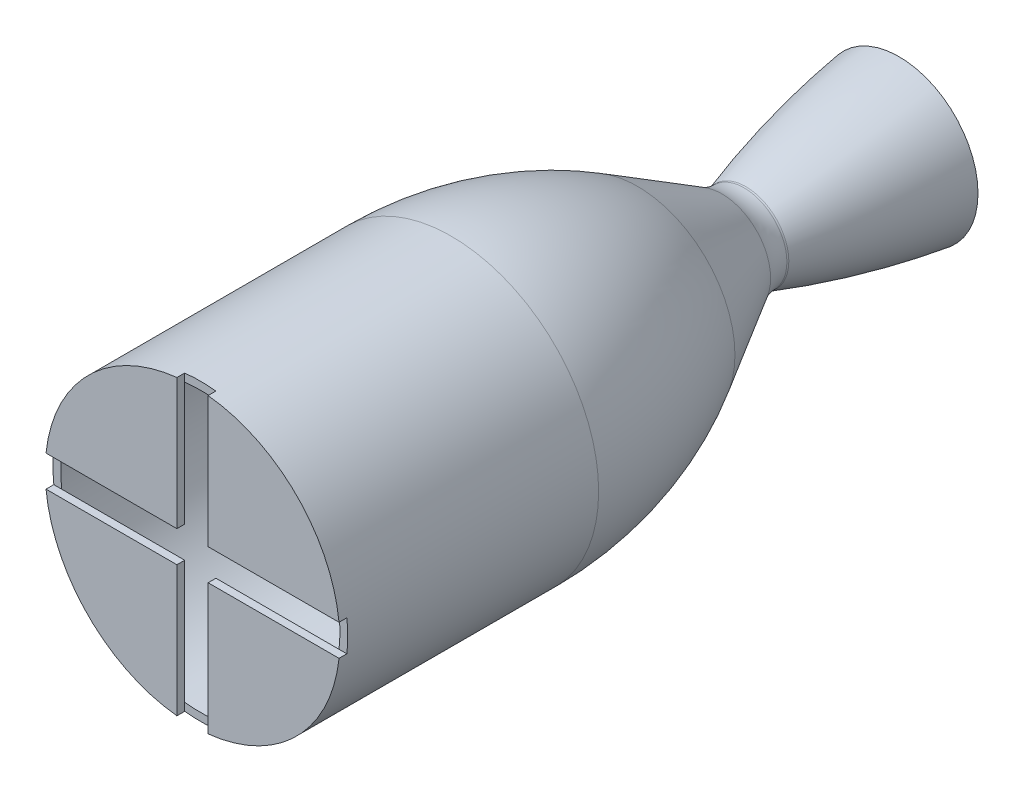
ISO-10303-21;
HEADER;
FILE_DESCRIPTION(('STEP AP214'),'2;1');
FILE_NAME('part.step','',(''),(''),'','','');
FILE_SCHEMA(('AUTOMOTIVE_DESIGN { 1 0 10303 214 1 1 1 1 }'));
ENDSEC;
DATA;
#1=APPLICATION_CONTEXT('core data for automotive mechanical design processes');
#2=APPLICATION_PROTOCOL_DEFINITION('international standard','automotive_design',2000,#1);
#3=PRODUCT_CONTEXT('',#1,'mechanical');
#4=PRODUCT('Part','Part','',(#3));
#5=PRODUCT_RELATED_PRODUCT_CATEGORY('part','',(#4));
#6=PRODUCT_DEFINITION_FORMATION('','',#4);
#7=PRODUCT_DEFINITION_CONTEXT('part definition',#1,'design');
#8=PRODUCT_DEFINITION('design','',#6,#7);
#9=PRODUCT_DEFINITION_SHAPE('','',#8);
#10=(LENGTH_UNIT() NAMED_UNIT(*) SI_UNIT(.MILLI.,.METRE.));
#11=(NAMED_UNIT(*) PLANE_ANGLE_UNIT() SI_UNIT($,.RADIAN.));
#12=(NAMED_UNIT(*) SI_UNIT($,.STERADIAN.) SOLID_ANGLE_UNIT());
#13=UNCERTAINTY_MEASURE_WITH_UNIT(LENGTH_MEASURE(1.E-05),#10,'distance_accuracy_value','');
#14=(GEOMETRIC_REPRESENTATION_CONTEXT(3) GLOBAL_UNCERTAINTY_ASSIGNED_CONTEXT((#13)) GLOBAL_UNIT_ASSIGNED_CONTEXT((#10,
#11,#12)) REPRESENTATION_CONTEXT('',''));
#15=CARTESIAN_POINT('',(0.,0.,0.));
#16=DIRECTION('',(0.,0.,1.));
#17=DIRECTION('',(1.,0.,0.));
#18=AXIS2_PLACEMENT_3D('',#15,#16,#17);
#19=CARTESIAN_POINT('',(0.,0.,0.));
#20=DIRECTION('',(0.,0.,-1.));
#21=DIRECTION('',(-1.,0.,0.));
#22=AXIS2_PLACEMENT_3D('',#19,#20,#21);
#23=PLANE('',#22);
#24=DIRECTION('',(0.,1.,0.));
#25=VECTOR('',#24,1.);
#26=CARTESIAN_POINT('',(-6.34999999999979,-59.9440000000002,0.));
#27=LINE('',#26,#25);
#28=CARTESIAN_POINT('',(-6.3499999999998,-56.4127366912828,0.));
#29=VERTEX_POINT('',#28);
#30=CARTESIAN_POINT('',(-6.34999999999998,-6.35,0.));
#31=VERTEX_POINT('',#30);
#32=EDGE_CURVE('E307',#29,#31,#27,.T.);
#33=ORIENTED_EDGE('',*,*,#32,.F.);
#34=CARTESIAN_POINT('',(0.,0.,0.));
#35=DIRECTION('',(0.,0.,1.));
#36=DIRECTION('',(1.,0.,0.));
#37=AXIS2_PLACEMENT_3D('',#34,#35,#36);
#38=CIRCLE('',#37,56.769);
#39=CARTESIAN_POINT('',(-56.4127366912828,-6.35,0.));
#40=VERTEX_POINT('',#39);
#41=EDGE_CURVE('E283',#40,#29,#38,.T.);
#42=ORIENTED_EDGE('',*,*,#41,.F.);
#43=DIRECTION('',(1.,0.,0.));
#44=VECTOR('',#43,1.);
#45=CARTESIAN_POINT('',(-59.944,-6.35,0.));
#46=LINE('',#45,#44);
#47=EDGE_CURVE('E348',#40,#31,#46,.T.);
#48=ORIENTED_EDGE('',*,*,#47,.T.);
#49=EDGE_LOOP('',(#33,#42,#48));
#50=FACE_BOUND('',#49,.T.);
#51=ADVANCED_FACE('F34',(#50),#23,.T.);
#52=CARTESIAN_POINT('',(0.,0.,3.175));
#53=DIRECTION('',(0.,0.,-1.));
#54=DIRECTION('',(-1.,0.,0.));
#55=AXIS2_PLACEMENT_3D('',#52,#53,#54);
#56=PLANE('',#55);
#57=DIRECTION('',(1.,0.,0.));
#58=VECTOR('',#57,1.);
#59=CARTESIAN_POINT('',(-59.944,6.35,3.175));
#60=LINE('',#59,#58);
#61=CARTESIAN_POINT('',(-59.6067163665304,6.35,3.175));
#62=VERTEX_POINT('',#61);
#63=CARTESIAN_POINT('',(-6.35000000000002,6.34999999999999,3.175));
#64=VERTEX_POINT('',#63);
#65=EDGE_CURVE('E195',#62,#64,#60,.T.);
#66=ORIENTED_EDGE('',*,*,#65,.T.);
#67=DIRECTION('',(0.,1.,0.));
#68=VECTOR('',#67,1.);
#69=CARTESIAN_POINT('',(-6.34999999999979,-59.9440000000002,3.175));
#70=LINE('',#69,#68);
#71=CARTESIAN_POINT('',(-6.35000000000021,59.6067163665303,3.175));
#72=VERTEX_POINT('',#71);
#73=EDGE_CURVE('E305',#64,#72,#70,.T.);
#74=ORIENTED_EDGE('',*,*,#73,.T.);
#75=CARTESIAN_POINT('',(0.,0.,3.175));
#76=DIRECTION('',(0.,0.,1.));
#77=DIRECTION('',(1.,0.,0.));
#78=AXIS2_PLACEMENT_3D('',#75,#76,#77);
#79=CIRCLE('',#78,59.944);
#80=EDGE_CURVE('E216',#72,#62,#79,.T.);
#81=ORIENTED_EDGE('',*,*,#80,.T.);
#82=EDGE_LOOP('',(#66,#74,#81));
#83=FACE_BOUND('',#82,.T.);
#84=ADVANCED_FACE('F365',(#83),#56,.F.);
#85=CARTESIAN_POINT('',(-59.6067163665304,-6.35,3.175));
#86=VERTEX_POINT('',#85);
#87=CARTESIAN_POINT('',(-6.34999999999979,-59.6067163665304,3.175));
#88=VERTEX_POINT('',#87);
#89=EDGE_CURVE('E213',#86,#88,#79,.T.);
#90=ORIENTED_EDGE('',*,*,#89,.T.);
#91=CARTESIAN_POINT('',(-6.34999999999998,-6.35,3.175));
#92=VERTEX_POINT('',#91);
#93=EDGE_CURVE('E179',#88,#92,#70,.T.);
#94=ORIENTED_EDGE('',*,*,#93,.T.);
#95=DIRECTION('',(1.,0.,0.));
#96=VECTOR('',#95,1.);
#97=CARTESIAN_POINT('',(-59.944,-6.35,3.175));
#98=LINE('',#97,#96);
#99=EDGE_CURVE('E210',#86,#92,#98,.T.);
#100=ORIENTED_EDGE('',*,*,#99,.F.);
#101=EDGE_LOOP('',(#90,#94,#100));
#102=FACE_BOUND('',#101,.T.);
#103=ADVANCED_FACE('F369',(#102),#56,.F.);
#104=CARTESIAN_POINT('',(-6.35000000000002,6.34999999999999,0.));
#105=VERTEX_POINT('',#104);
#106=CARTESIAN_POINT('',(-6.3500000000002,56.4127366912827,0.));
#107=VERTEX_POINT('',#106);
#108=EDGE_CURVE('E304',#105,#107,#27,.T.);
#109=ORIENTED_EDGE('',*,*,#108,.F.);
#110=DIRECTION('',(1.,0.,0.));
#111=VECTOR('',#110,1.);
#112=CARTESIAN_POINT('',(-59.944,6.35,0.));
#113=LINE('',#112,#111);
#114=CARTESIAN_POINT('',(-56.4127366912828,6.35,0.));
#115=VERTEX_POINT('',#114);
#116=EDGE_CURVE('E319',#115,#105,#113,.T.);
#117=ORIENTED_EDGE('',*,*,#116,.F.);
#118=EDGE_CURVE('E259',#107,#115,#38,.T.);
#119=ORIENTED_EDGE('',*,*,#118,.F.);
#120=EDGE_LOOP('',(#109,#117,#119));
#121=FACE_BOUND('',#120,.T.);
#122=ADVANCED_FACE('F318',(#121),#23,.T.);
#123=CARTESIAN_POINT('',(-59.944,6.35,3.175));
#124=DIRECTION('',(0.,1.,0.));
#125=DIRECTION('',(0.,0.,1.));
#126=AXIS2_PLACEMENT_3D('',#123,#124,#125);
#127=PLANE('',#126);
#128=ORIENTED_EDGE('',*,*,#116,.T.);
#129=DIRECTION('',(0.,0.,1.));
#130=VECTOR('',#129,1.);
#131=CARTESIAN_POINT('',(-6.35000000000002,6.35,3.175));
#132=LINE('',#131,#130);
#133=EDGE_CURVE('E186',#105,#64,#132,.T.);
#134=ORIENTED_EDGE('',*,*,#133,.T.);
#135=ORIENTED_EDGE('',*,*,#65,.F.);
#136=DIRECTION('',(0.,0.,1.));
#137=VECTOR('',#136,1.);
#138=CARTESIAN_POINT('',(-59.6067163665304,6.35,0.));
#139=LINE('',#138,#137);
#140=CARTESIAN_POINT('',(-59.6067163665304,6.35,0.));
#141=VERTEX_POINT('',#140);
#142=EDGE_CURVE('E271',#141,#62,#139,.T.);
#143=ORIENTED_EDGE('',*,*,#142,.F.);
#144=EDGE_CURVE('E205',#141,#115,#113,.T.);
#145=ORIENTED_EDGE('',*,*,#144,.T.);
#146=EDGE_LOOP('',(#128,#134,#135,#143,#145));
#147=FACE_BOUND('',#146,.T.);
#148=ADVANCED_FACE('F336',(#147),#127,.F.);
#149=CARTESIAN_POINT('',(-59.944,-6.35,3.175));
#150=DIRECTION('',(0.,-1.,0.));
#151=DIRECTION('',(0.,0.,-1.));
#152=AXIS2_PLACEMENT_3D('',#149,#150,#151);
#153=PLANE('',#152);
#154=ORIENTED_EDGE('',*,*,#99,.T.);
#155=DIRECTION('',(0.,0.,-1.));
#156=VECTOR('',#155,1.);
#157=CARTESIAN_POINT('',(-6.34999999999998,-6.35,3.175));
#158=LINE('',#157,#156);
#159=EDGE_CURVE('E11',#92,#31,#158,.T.);
#160=ORIENTED_EDGE('',*,*,#159,.T.);
#161=ORIENTED_EDGE('',*,*,#47,.F.);
#162=CARTESIAN_POINT('',(-59.6067163665304,-6.35,0.));
#163=VERTEX_POINT('',#162);
#164=EDGE_CURVE('E204',#163,#40,#46,.T.);
#165=ORIENTED_EDGE('',*,*,#164,.F.);
#166=DIRECTION('',(0.,0.,1.));
#167=VECTOR('',#166,1.);
#168=CARTESIAN_POINT('',(-59.6067163665304,-6.35,0.));
#169=LINE('',#168,#167);
#170=EDGE_CURVE('E265',#86,#163,#169,.F.);
#171=ORIENTED_EDGE('',*,*,#170,.F.);
#172=EDGE_LOOP('',(#154,#160,#161,#165,#171));
#173=FACE_BOUND('',#172,.T.);
#174=ADVANCED_FACE('F363',(#173),#153,.F.);
#175=DIRECTION('',(0.,1.,0.));
#176=VECTOR('',#175,1.);
#177=CARTESIAN_POINT('',(6.35000000000021,-59.9440000000002,0.));
#178=LINE('',#177,#176);
#179=CARTESIAN_POINT('',(6.3500000000002,-56.4127366912827,0.));
#180=VERTEX_POINT('',#179);
#181=CARTESIAN_POINT('',(6.35000000000002,-6.35,0.));
#182=VERTEX_POINT('',#181);
#183=EDGE_CURVE('E165',#180,#182,#178,.T.);
#184=ORIENTED_EDGE('',*,*,#183,.T.);
#185=CARTESIAN_POINT('',(56.4127366912828,-6.35,0.));
#186=VERTEX_POINT('',#185);
#187=EDGE_CURVE('E209',#182,#186,#46,.T.);
#188=ORIENTED_EDGE('',*,*,#187,.T.);
#189=EDGE_CURVE('E254',#180,#186,#38,.T.);
#190=ORIENTED_EDGE('',*,*,#189,.F.);
#191=EDGE_LOOP('',(#184,#188,#190));
#192=FACE_BOUND('',#191,.T.);
#193=ADVANCED_FACE('F347',(#192),#23,.T.);
#194=CARTESIAN_POINT('',(59.6067163665304,6.35,3.175));
#195=VERTEX_POINT('',#194);
#196=CARTESIAN_POINT('',(6.34999999999979,59.6067163665304,3.175));
#197=VERTEX_POINT('',#196);
#198=EDGE_CURVE('E217',#195,#197,#79,.T.);
#199=ORIENTED_EDGE('',*,*,#198,.T.);
#200=DIRECTION('',(0.,1.,0.));
#201=VECTOR('',#200,1.);
#202=CARTESIAN_POINT('',(6.35000000000021,-59.9440000000002,3.175));
#203=LINE('',#202,#201);
#204=CARTESIAN_POINT('',(6.34999999999998,6.34999999999999,3.175));
#205=VERTEX_POINT('',#204);
#206=EDGE_CURVE('E292',#205,#197,#203,.T.);
#207=ORIENTED_EDGE('',*,*,#206,.F.);
#208=EDGE_CURVE('E199',#205,#195,#60,.T.);
#209=ORIENTED_EDGE('',*,*,#208,.T.);
#210=EDGE_LOOP('',(#199,#207,#209));
#211=FACE_BOUND('',#210,.T.);
#212=ADVANCED_FACE('F291',(#211),#56,.F.);
#213=CARTESIAN_POINT('',(6.35000000000003,-6.35,3.175));
#214=VERTEX_POINT('',#213);
#215=CARTESIAN_POINT('',(59.6067163665304,-6.35,3.175));
#216=VERTEX_POINT('',#215);
#217=EDGE_CURVE('E194',#214,#216,#98,.T.);
#218=ORIENTED_EDGE('',*,*,#217,.F.);
#219=CARTESIAN_POINT('',(6.35000000000021,-59.6067163665303,3.175));
#220=VERTEX_POINT('',#219);
#221=EDGE_CURVE('E57',#220,#214,#203,.T.);
#222=ORIENTED_EDGE('',*,*,#221,.F.);
#223=EDGE_CURVE('E174',#220,#216,#79,.T.);
#224=ORIENTED_EDGE('',*,*,#223,.T.);
#225=EDGE_LOOP('',(#218,#222,#224));
#226=FACE_BOUND('',#225,.T.);
#227=ADVANCED_FACE('F36',(#226),#56,.F.);
#228=CARTESIAN_POINT('',(6.34999999999997,6.35,0.));
#229=VERTEX_POINT('',#228);
#230=CARTESIAN_POINT('',(6.3499999999998,56.4127366912828,0.));
#231=VERTEX_POINT('',#230);
#232=EDGE_CURVE('E49',#229,#231,#178,.T.);
#233=ORIENTED_EDGE('',*,*,#232,.T.);
#234=CARTESIAN_POINT('',(56.4127366912828,6.35,0.));
#235=VERTEX_POINT('',#234);
#236=EDGE_CURVE('E255',#235,#231,#38,.T.);
#237=ORIENTED_EDGE('',*,*,#236,.F.);
#238=EDGE_CURVE('E203',#229,#235,#113,.T.);
#239=ORIENTED_EDGE('',*,*,#238,.F.);
#240=EDGE_LOOP('',(#233,#237,#239));
#241=FACE_BOUND('',#240,.T.);
#242=ADVANCED_FACE('F329',(#241),#23,.T.);
#243=CARTESIAN_POINT('',(0.,0.,0.));
#244=DIRECTION('',(0.,0.,1.));
#245=DIRECTION('',(1.,0.,0.));
#246=AXIS2_PLACEMENT_3D('',#243,#244,#245);
#247=CYLINDRICAL_SURFACE('',#246,56.769);
#248=ORIENTED_EDGE('',*,*,#236,.T.);
#249=CARTESIAN_POINT('',(0.,0.,0.));
#250=DIRECTION('',(0.,0.,-1.));
#251=DIRECTION('',(-1.,0.,0.));
#252=AXIS2_PLACEMENT_3D('',#249,#250,#251);
#253=CIRCLE('',#252,56.769);
#254=EDGE_CURVE('E185',#107,#231,#253,.T.);
#255=ORIENTED_EDGE('',*,*,#254,.F.);
#256=ORIENTED_EDGE('',*,*,#118,.T.);
#257=EDGE_CURVE('E281',#115,#40,#38,.T.);
#258=ORIENTED_EDGE('',*,*,#257,.T.);
#259=ORIENTED_EDGE('',*,*,#41,.T.);
#260=EDGE_CURVE('E183',#180,#29,#253,.T.);
#261=ORIENTED_EDGE('',*,*,#260,.F.);
#262=ORIENTED_EDGE('',*,*,#189,.T.);
#263=EDGE_CURVE('E198',#186,#235,#38,.T.);
#264=ORIENTED_EDGE('',*,*,#263,.T.);
#265=EDGE_LOOP('',(#248,#255,#256,#258,#259,#261,#262,#264));
#266=FACE_BOUND('',#265,.T.);
#267=CARTESIAN_POINT('',(0.,0.,-102.108));
#268=DIRECTION('',(0.,0.,1.));
#269=DIRECTION('',(1.,0.,0.));
#270=AXIS2_PLACEMENT_3D('',#267,#268,#269);
#271=CIRCLE('',#270,56.769);
#272=CARTESIAN_POINT('',(56.769,0.,-102.108));
#273=VERTEX_POINT('',#272);
#274=EDGE_CURVE('E251',#273,#273,#271,.T.);
#275=ORIENTED_EDGE('',*,*,#274,.F.);
#276=EDGE_LOOP('',(#275));
#277=FACE_BOUND('',#276,.T.);
#278=ADVANCED_FACE('F322',(#266,#277),#247,.F.);
#279=CARTESIAN_POINT('',(0.,0.,-102.108));
#280=DIRECTION('',(0.,0.,1.));
#281=DIRECTION('',(1.,0.,0.));
#282=AXIS2_PLACEMENT_3D('',#279,#280,#281);
#283=DEGENERATE_TOROIDAL_SURFACE('',#282,91.567,148.336,.F.);
#284=ORIENTED_EDGE('',*,*,#274,.T.);
#285=EDGE_LOOP('',(#284));
#286=FACE_BOUND('',#285,.T.);
#287=CARTESIAN_POINT('',(0.,0.,-176.276));
#288=DIRECTION('',(0.,0.,1.));
#289=DIRECTION('',(1.,0.,0.));
#290=AXIS2_PLACEMENT_3D('',#287,#288,#289);
#291=CIRCLE('',#290,36.8957442957684);
#292=CARTESIAN_POINT('',(36.8957442957684,0.,-176.276));
#293=VERTEX_POINT('',#292);
#294=EDGE_CURVE('E248',#293,#293,#291,.T.);
#295=ORIENTED_EDGE('',*,*,#294,.F.);
#296=EDGE_LOOP('',(#295));
#297=FACE_BOUND('',#296,.T.);
#298=ADVANCED_FACE('F377',(#286,#297),#283,.T.);
#299=CARTESIAN_POINT('',(0.,0.,-210.593607923697));
#300=DIRECTION('',(0.,0.,1.));
#301=DIRECTION('',(1.,0.,0.));
#302=AXIS2_PLACEMENT_3D('',#299,#300,#301);
#303=CONICAL_SURFACE('',#302,17.0824641230777,0.523598775598301);
#304=ORIENTED_EDGE('',*,*,#294,.T.);
#305=EDGE_LOOP('',(#304));
#306=FACE_BOUND('',#305,.T.);
#307=CARTESIAN_POINT('',(0.,0.,-210.593607923697));
#308=DIRECTION('',(0.,0.,1.));
#309=DIRECTION('',(1.,0.,0.));
#310=AXIS2_PLACEMENT_3D('',#307,#308,#309);
#311=CIRCLE('',#310,17.0824641230777);
#312=CARTESIAN_POINT('',(17.0824641230777,0.,-210.593607923697));
#313=VERTEX_POINT('',#312);
#314=EDGE_CURVE('E245',#313,#313,#311,.T.);
#315=ORIENTED_EDGE('',*,*,#314,.F.);
#316=EDGE_LOOP('',(#315));
#317=FACE_BOUND('',#316,.T.);
#318=ADVANCED_FACE('F491',(#306,#317),#303,.F.);
#319=CARTESIAN_POINT('',(0.,0.,-221.261607923697));
#320=DIRECTION('',(0.,0.,1.));
#321=DIRECTION('',(1.,0.,0.));
#322=AXIS2_PLACEMENT_3D('',#319,#320,#321);
#323=TOROIDAL_SURFACE('',#322,35.5599821382225,21.336);
#324=ORIENTED_EDGE('',*,*,#314,.T.);
#325=EDGE_LOOP('',(#324));
#326=FACE_BOUND('',#325,.T.);
#327=CARTESIAN_POINT('',(0.,0.,-221.234));
#328=DIRECTION('',(0.,0.,1.));
#329=DIRECTION('',(1.,0.,0.));
#330=AXIS2_PLACEMENT_3D('',#327,#328,#329);
#331=CIRCLE('',#330,14.224);
#332=CARTESIAN_POINT('',(14.224,0.,-221.234));
#333=VERTEX_POINT('',#332);
#334=EDGE_CURVE('E242',#333,#333,#331,.T.);
#335=ORIENTED_EDGE('',*,*,#334,.F.);
#336=EDGE_LOOP('',(#335));
#337=FACE_BOUND('',#336,.T.);
#338=ADVANCED_FACE('F481',(#326,#337),#323,.T.);
#339=CARTESIAN_POINT('',(0.,0.,-221.240901980924));
#340=DIRECTION('',(0.,0.,1.));
#341=DIRECTION('',(1.,0.,0.));
#342=AXIS2_PLACEMENT_3D('',#339,#340,#341);
#343=TOROIDAL_SURFACE('',#342,19.5579955345556,5.33399999999999);
#344=ORIENTED_EDGE('',*,*,#334,.T.);
#345=EDGE_LOOP('',(#344));
#346=FACE_BOUND('',#345,.T.);
#347=CARTESIAN_POINT('',(0.,0.,-222.91043356868));
#348=DIRECTION('',(0.,0.,1.));
#349=DIRECTION('',(1.,0.,0.));
#350=AXIS2_PLACEMENT_3D('',#347,#348,#349);
#351=CIRCLE('',#350,14.4920089300052);
#352=CARTESIAN_POINT('',(14.4920089300052,0.,-222.91043356868));
#353=VERTEX_POINT('',#352);
#354=EDGE_CURVE('E239',#353,#353,#351,.T.);
#355=ORIENTED_EDGE('',*,*,#354,.F.);
#356=EDGE_LOOP('',(#355));
#357=FACE_BOUND('',#356,.T.);
#358=ADVANCED_FACE('F471',(#346,#357),#343,.T.);
#359=CARTESIAN_POINT('',(0.,0.,-335.302405298385));
#360=DIRECTION('',(0.,0.,1.));
#361=DIRECTION('',(1.,0.,0.));
#362=AXIS2_PLACEMENT_3D('',#359,#360,#361);
#363=DEGENERATE_TOROIDAL_SURFACE('',#362,326.547494256012,359.082021330303,.F.);
#364=ORIENTED_EDGE('',*,*,#354,.T.);
#365=EDGE_LOOP('',(#364));
#366=FACE_BOUND('',#365,.T.);
#367=CARTESIAN_POINT('',(0.,0.,-284.734));
#368=DIRECTION('',(0.,0.,1.));
#369=DIRECTION('',(1.,0.,0.));
#370=AXIS2_PLACEMENT_3D('',#367,#368,#369);
#371=CIRCLE('',#370,28.956);
#372=CARTESIAN_POINT('',(28.956,0.,-284.734));
#373=VERTEX_POINT('',#372);
#374=EDGE_CURVE('E236',#373,#373,#371,.T.);
#375=ORIENTED_EDGE('',*,*,#374,.F.);
#376=EDGE_LOOP('',(#375));
#377=FACE_BOUND('',#376,.T.);
#378=ADVANCED_FACE('F461',(#366,#377),#363,.T.);
#379=CARTESIAN_POINT('',(0.,0.,-284.286874615589));
#380=DIRECTION('',(0.,0.,1.));
#381=DIRECTION('',(1.,0.,0.));
#382=AXIS2_PLACEMENT_3D('',#379,#380,#381);
#383=CONICAL_SURFACE('',#382,32.0993586958244,1.42949974529868);
#384=ORIENTED_EDGE('',*,*,#374,.T.);
#385=EDGE_LOOP('',(#384));
#386=FACE_BOUND('',#385,.T.);
#387=CARTESIAN_POINT('',(0.,0.,-284.286874615589));
#388=DIRECTION('',(0.,0.,1.));
#389=DIRECTION('',(1.,0.,0.));
#390=AXIS2_PLACEMENT_3D('',#387,#388,#389);
#391=CIRCLE('',#390,32.0993586958244);
#392=CARTESIAN_POINT('',(32.0993586958244,0.,-284.286874615589));
#393=VERTEX_POINT('',#392);
#394=EDGE_CURVE('E233',#393,#393,#391,.T.);
#395=ORIENTED_EDGE('',*,*,#394,.F.);
#396=EDGE_LOOP('',(#395));
#397=FACE_BOUND('',#396,.T.);
#398=ADVANCED_FACE('F451',(#386,#397),#383,.T.);
#399=CARTESIAN_POINT('',(0.,0.,-335.302405298385));
#400=DIRECTION('',(0.,0.,1.));
#401=DIRECTION('',(1.,0.,0.));
#402=AXIS2_PLACEMENT_3D('',#399,#400,#401);
#403=DEGENERATE_TOROIDAL_SURFACE('',#402,326.547494256012,362.257021330303,.F.);
#404=CARTESIAN_POINT('',(0.,0.,-221.916664766445));
#405=DIRECTION('',(0.,0.,1.));
#406=DIRECTION('',(1.,0.,0.));
#407=AXIS2_PLACEMENT_3D('',#404,#405,#406);
#408=CIRCLE('',#407,17.5074771469995);
#409=CARTESIAN_POINT('',(17.5074771469995,0.,-221.916664766445));
#410=VERTEX_POINT('',#409);
#411=EDGE_CURVE('E230',#410,#410,#408,.T.);
#412=ORIENTED_EDGE('',*,*,#411,.F.);
#413=EDGE_LOOP('',(#412));
#414=FACE_BOUND('',#413,.T.);
#415=ORIENTED_EDGE('',*,*,#394,.T.);
#416=EDGE_LOOP('',(#415));
#417=FACE_BOUND('',#416,.T.);
#418=ADVANCED_FACE('F441',(#414,#417),#403,.F.);
#419=CARTESIAN_POINT('',(0.,0.,-221.240901980924));
#420=DIRECTION('',(0.,0.,1.));
#421=DIRECTION('',(1.,0.,0.));
#422=AXIS2_PLACEMENT_3D('',#419,#420,#421);
#423=TOROIDAL_SURFACE('',#422,19.5579955345556,2.15899999999999);
#424=CARTESIAN_POINT('',(0.,0.,-221.238108321979));
#425=DIRECTION('',(0.,0.,1.));
#426=DIRECTION('',(1.,0.,0.));
#427=AXIS2_PLACEMENT_3D('',#424,#425,#426);
#428=CIRCLE('',#427,17.3989973419974);
#429=CARTESIAN_POINT('',(17.3989973419974,0.,-221.238108321979));
#430=VERTEX_POINT('',#429);
#431=EDGE_CURVE('E227',#430,#430,#428,.T.);
#432=ORIENTED_EDGE('',*,*,#431,.F.);
#433=EDGE_LOOP('',(#432));
#434=FACE_BOUND('',#433,.T.);
#435=ORIENTED_EDGE('',*,*,#411,.T.);
#436=EDGE_LOOP('',(#435));
#437=FACE_BOUND('',#436,.T.);
#438=ADVANCED_FACE('F431',(#434,#437),#423,.F.);
#439=CARTESIAN_POINT('',(0.,0.,-221.261607923697));
#440=DIRECTION('',(0.,0.,1.));
#441=DIRECTION('',(1.,0.,0.));
#442=AXIS2_PLACEMENT_3D('',#439,#440,#441);
#443=TOROIDAL_SURFACE('',#442,35.5599821382225,18.161);
#444=CARTESIAN_POINT('',(0.,0.,-212.181107923697));
#445=DIRECTION('',(0.,0.,1.));
#446=DIRECTION('',(1.,0.,0.));
#447=AXIS2_PLACEMENT_3D('',#444,#445,#446);
#448=CIRCLE('',#447,19.8320947800933);
#449=CARTESIAN_POINT('',(19.8320947800933,0.,-212.181107923697));
#450=VERTEX_POINT('',#449);
#451=EDGE_CURVE('E224',#450,#450,#448,.T.);
#452=ORIENTED_EDGE('',*,*,#451,.F.);
#453=EDGE_LOOP('',(#452));
#454=FACE_BOUND('',#453,.T.);
#455=ORIENTED_EDGE('',*,*,#431,.T.);
#456=EDGE_LOOP('',(#455));
#457=FACE_BOUND('',#456,.T.);
#458=ADVANCED_FACE('F421',(#454,#457),#443,.F.);
#459=CARTESIAN_POINT('',(0.,0.,-212.181107923697));
#460=DIRECTION('',(0.,0.,1.));
#461=DIRECTION('',(1.,0.,0.));
#462=AXIS2_PLACEMENT_3D('',#459,#460,#461);
#463=CONICAL_SURFACE('',#462,19.8320947800933,0.523598775598301);
#464=CARTESIAN_POINT('',(0.,0.,-177.8635));
#465=DIRECTION('',(0.,0.,1.));
#466=DIRECTION('',(1.,0.,0.));
#467=AXIS2_PLACEMENT_3D('',#464,#465,#466);
#468=CIRCLE('',#467,39.645374952784);
#469=CARTESIAN_POINT('',(39.645374952784,0.,-177.8635));
#470=VERTEX_POINT('',#469);
#471=EDGE_CURVE('E221',#470,#470,#468,.T.);
#472=ORIENTED_EDGE('',*,*,#471,.F.);
#473=EDGE_LOOP('',(#472));
#474=FACE_BOUND('',#473,.T.);
#475=ORIENTED_EDGE('',*,*,#451,.T.);
#476=EDGE_LOOP('',(#475));
#477=FACE_BOUND('',#476,.T.);
#478=ADVANCED_FACE('F410',(#474,#477),#463,.T.);
#479=CARTESIAN_POINT('',(0.,0.,-102.108));
#480=DIRECTION('',(0.,0.,1.));
#481=DIRECTION('',(1.,0.,0.));
#482=AXIS2_PLACEMENT_3D('',#479,#480,#481);
#483=DEGENERATE_TOROIDAL_SURFACE('',#482,91.567,151.511,.F.);
#484=CARTESIAN_POINT('',(0.,0.,-102.108));
#485=DIRECTION('',(0.,0.,1.));
#486=DIRECTION('',(1.,0.,0.));
#487=AXIS2_PLACEMENT_3D('',#484,#485,#486);
#488=CIRCLE('',#487,59.944);
#489=CARTESIAN_POINT('',(59.944,0.,-102.108));
#490=VERTEX_POINT('',#489);
#491=EDGE_CURVE('E218',#490,#490,#488,.T.);
#492=ORIENTED_EDGE('',*,*,#491,.F.);
#493=EDGE_LOOP('',(#492));
#494=FACE_BOUND('',#493,.T.);
#495=ORIENTED_EDGE('',*,*,#471,.T.);
#496=EDGE_LOOP('',(#495));
#497=FACE_BOUND('',#496,.T.);
#498=ADVANCED_FACE('F359',(#494,#497),#483,.F.);
#499=CARTESIAN_POINT('',(0.,0.,0.));
#500=DIRECTION('',(0.,0.,1.));
#501=DIRECTION('',(1.,0.,0.));
#502=AXIS2_PLACEMENT_3D('',#499,#500,#501);
#503=CYLINDRICAL_SURFACE('',#502,59.944);
#504=ORIENTED_EDGE('',*,*,#80,.F.);
#505=DIRECTION('',(0.,0.,1.));
#506=VECTOR('',#505,1.);
#507=CARTESIAN_POINT('',(-6.35000000000021,59.6067163665303,0.));
#508=LINE('',#507,#506);
#509=CARTESIAN_POINT('',(-6.35000000000021,59.6067163665303,0.));
#510=VERTEX_POINT('',#509);
#511=EDGE_CURVE('E189',#72,#510,#508,.F.);
#512=ORIENTED_EDGE('',*,*,#511,.T.);
#513=CARTESIAN_POINT('',(0.,0.,0.));
#514=DIRECTION('',(0.,0.,-1.));
#515=DIRECTION('',(-1.,0.,0.));
#516=AXIS2_PLACEMENT_3D('',#513,#514,#515);
#517=CIRCLE('',#516,59.944);
#518=CARTESIAN_POINT('',(6.34999999999979,59.6067163665304,0.));
#519=VERTEX_POINT('',#518);
#520=EDGE_CURVE('E159',#510,#519,#517,.T.);
#521=ORIENTED_EDGE('',*,*,#520,.T.);
#522=DIRECTION('',(0.,0.,1.));
#523=VECTOR('',#522,1.);
#524=CARTESIAN_POINT('',(6.34999999999979,59.6067163665304,0.));
#525=LINE('',#524,#523);
#526=EDGE_CURVE('E160',#519,#197,#525,.T.);
#527=ORIENTED_EDGE('',*,*,#526,.T.);
#528=ORIENTED_EDGE('',*,*,#198,.F.);
#529=DIRECTION('',(0.,0.,1.));
#530=VECTOR('',#529,1.);
#531=CARTESIAN_POINT('',(59.6067163665304,6.35,0.));
#532=LINE('',#531,#530);
#533=CARTESIAN_POINT('',(59.6067163665304,6.35,0.));
#534=VERTEX_POINT('',#533);
#535=EDGE_CURVE('E268',#195,#534,#532,.F.);
#536=ORIENTED_EDGE('',*,*,#535,.T.);
#537=CARTESIAN_POINT('',(0.,0.,0.));
#538=DIRECTION('',(0.,0.,-1.));
#539=DIRECTION('',(-1.,0.,0.));
#540=AXIS2_PLACEMENT_3D('',#537,#538,#539);
#541=CIRCLE('',#540,59.944);
#542=CARTESIAN_POINT('',(59.6067163665304,-6.35,0.));
#543=VERTEX_POINT('',#542);
#544=EDGE_CURVE('E258',#534,#543,#541,.T.);
#545=ORIENTED_EDGE('',*,*,#544,.T.);
#546=DIRECTION('',(0.,0.,1.));
#547=VECTOR('',#546,1.);
#548=CARTESIAN_POINT('',(59.6067163665304,-6.35,0.));
#549=LINE('',#548,#547);
#550=EDGE_CURVE('E262',#543,#216,#549,.T.);
#551=ORIENTED_EDGE('',*,*,#550,.T.);
#552=ORIENTED_EDGE('',*,*,#223,.F.);
#553=DIRECTION('',(0.,0.,1.));
#554=VECTOR('',#553,1.);
#555=CARTESIAN_POINT('',(6.35000000000021,-59.6067163665303,0.));
#556=LINE('',#555,#554);
#557=CARTESIAN_POINT('',(6.35000000000021,-59.6067163665303,0.));
#558=VERTEX_POINT('',#557);
#559=EDGE_CURVE('E163',#220,#558,#556,.F.);
#560=ORIENTED_EDGE('',*,*,#559,.T.);
#561=CARTESIAN_POINT('',(-6.34999999999979,-59.6067163665304,0.));
#562=VERTEX_POINT('',#561);
#563=EDGE_CURVE('E148',#558,#562,#517,.T.);
#564=ORIENTED_EDGE('',*,*,#563,.T.);
#565=DIRECTION('',(0.,0.,1.));
#566=VECTOR('',#565,1.);
#567=CARTESIAN_POINT('',(-6.34999999999979,-59.6067163665304,0.));
#568=LINE('',#567,#566);
#569=EDGE_CURVE('E192',#562,#88,#568,.T.);
#570=ORIENTED_EDGE('',*,*,#569,.T.);
#571=ORIENTED_EDGE('',*,*,#89,.F.);
#572=ORIENTED_EDGE('',*,*,#170,.T.);
#573=EDGE_CURVE('E263',#163,#141,#541,.T.);
#574=ORIENTED_EDGE('',*,*,#573,.T.);
#575=ORIENTED_EDGE('',*,*,#142,.T.);
#576=EDGE_LOOP('',(#504,#512,#521,#527,#528,#536,#545,#551,#552,#560,#564,#570,#571,#572,#574,#575));
#577=FACE_BOUND('',#576,.T.);
#578=ORIENTED_EDGE('',*,*,#491,.T.);
#579=EDGE_LOOP('',(#578));
#580=FACE_BOUND('',#579,.T.);
#581=ADVANCED_FACE('F171',(#577,#580),#503,.T.);
#582=ORIENTED_EDGE('',*,*,#208,.F.);
#583=DIRECTION('',(0.,0.,-1.));
#584=VECTOR('',#583,1.);
#585=CARTESIAN_POINT('',(6.34999999999997,6.35,3.175));
#586=LINE('',#585,#584);
#587=EDGE_CURVE('E175',#205,#229,#586,.T.);
#588=ORIENTED_EDGE('',*,*,#587,.T.);
#589=ORIENTED_EDGE('',*,*,#238,.T.);
#590=EDGE_CURVE('E200',#235,#534,#113,.T.);
#591=ORIENTED_EDGE('',*,*,#590,.T.);
#592=ORIENTED_EDGE('',*,*,#535,.F.);
#593=EDGE_LOOP('',(#582,#588,#589,#591,#592));
#594=FACE_BOUND('',#593,.T.);
#595=ADVANCED_FACE('F351',(#594),#127,.F.);
#596=CARTESIAN_POINT('',(-59.944,6.35,0.));
#597=DIRECTION('',(0.,0.,-1.));
#598=DIRECTION('',(-1.,0.,0.));
#599=AXIS2_PLACEMENT_3D('',#596,#597,#598);
#600=PLANE('',#599);
#601=ORIENTED_EDGE('',*,*,#144,.F.);
#602=ORIENTED_EDGE('',*,*,#573,.F.);
#603=ORIENTED_EDGE('',*,*,#164,.T.);
#604=ORIENTED_EDGE('',*,*,#257,.F.);
#605=EDGE_LOOP('',(#601,#602,#603,#604));
#606=FACE_BOUND('',#605,.T.);
#607=ADVANCED_FACE('F339',(#606),#600,.F.);
#608=EDGE_CURVE('E206',#186,#543,#46,.T.);
#609=ORIENTED_EDGE('',*,*,#608,.T.);
#610=ORIENTED_EDGE('',*,*,#544,.F.);
#611=ORIENTED_EDGE('',*,*,#590,.F.);
#612=ORIENTED_EDGE('',*,*,#263,.F.);
#613=EDGE_LOOP('',(#609,#610,#611,#612));
#614=FACE_BOUND('',#613,.T.);
#615=ADVANCED_FACE('F350',(#614),#600,.F.);
#616=ORIENTED_EDGE('',*,*,#187,.F.);
#617=DIRECTION('',(0.,0.,1.));
#618=VECTOR('',#617,1.);
#619=CARTESIAN_POINT('',(6.35000000000003,-6.35,3.175));
#620=LINE('',#619,#618);
#621=EDGE_CURVE('E42',#182,#214,#620,.T.);
#622=ORIENTED_EDGE('',*,*,#621,.T.);
#623=ORIENTED_EDGE('',*,*,#217,.T.);
#624=ORIENTED_EDGE('',*,*,#550,.F.);
#625=ORIENTED_EDGE('',*,*,#608,.F.);
#626=EDGE_LOOP('',(#616,#622,#623,#624,#625));
#627=FACE_BOUND('',#626,.T.);
#628=ADVANCED_FACE('F277',(#627),#153,.F.);
#629=CARTESIAN_POINT('',(-6.34999999999979,-59.9440000000002,3.175));
#630=DIRECTION('',(-1.,0.,0.));
#631=DIRECTION('',(0.,-1.,0.));
#632=AXIS2_PLACEMENT_3D('',#629,#630,#631);
#633=PLANE('',#632);
#634=EDGE_CURVE('E154',#562,#29,#27,.T.);
#635=ORIENTED_EDGE('',*,*,#634,.T.);
#636=ORIENTED_EDGE('',*,*,#32,.T.);
#637=ORIENTED_EDGE('',*,*,#159,.F.);
#638=ORIENTED_EDGE('',*,*,#93,.F.);
#639=ORIENTED_EDGE('',*,*,#569,.F.);
#640=EDGE_LOOP('',(#635,#636,#637,#638,#639));
#641=FACE_BOUND('',#640,.T.);
#642=ADVANCED_FACE('F388',(#641),#633,.F.);
#643=CARTESIAN_POINT('',(6.35000000000021,-59.9440000000002,3.175));
#644=DIRECTION('',(1.,0.,0.));
#645=DIRECTION('',(0.,1.,0.));
#646=AXIS2_PLACEMENT_3D('',#643,#644,#645);
#647=PLANE('',#646);
#648=ORIENTED_EDGE('',*,*,#221,.T.);
#649=ORIENTED_EDGE('',*,*,#621,.F.);
#650=ORIENTED_EDGE('',*,*,#183,.F.);
#651=EDGE_CURVE('E151',#558,#180,#178,.T.);
#652=ORIENTED_EDGE('',*,*,#651,.F.);
#653=ORIENTED_EDGE('',*,*,#559,.F.);
#654=EDGE_LOOP('',(#648,#649,#650,#652,#653));
#655=FACE_BOUND('',#654,.T.);
#656=ADVANCED_FACE('F162',(#655),#647,.F.);
#657=CARTESIAN_POINT('',(-6.34999999999979,-59.9440000000002,0.));
#658=DIRECTION('',(0.,0.,-1.));
#659=DIRECTION('',(-1.,0.,0.));
#660=AXIS2_PLACEMENT_3D('',#657,#658,#659);
#661=PLANE('',#660);
#662=ORIENTED_EDGE('',*,*,#260,.T.);
#663=ORIENTED_EDGE('',*,*,#634,.F.);
#664=ORIENTED_EDGE('',*,*,#563,.F.);
#665=ORIENTED_EDGE('',*,*,#651,.T.);
#666=EDGE_LOOP('',(#662,#663,#664,#665));
#667=FACE_BOUND('',#666,.T.);
#668=ADVANCED_FACE('F150',(#667),#661,.F.);
#669=ORIENTED_EDGE('',*,*,#73,.F.);
#670=ORIENTED_EDGE('',*,*,#133,.F.);
#671=ORIENTED_EDGE('',*,*,#108,.T.);
#672=EDGE_CURVE('E166',#107,#510,#27,.T.);
#673=ORIENTED_EDGE('',*,*,#672,.T.);
#674=ORIENTED_EDGE('',*,*,#511,.F.);
#675=EDGE_LOOP('',(#669,#670,#671,#673,#674));
#676=FACE_BOUND('',#675,.T.);
#677=ADVANCED_FACE('F314',(#676),#633,.F.);
#678=ORIENTED_EDGE('',*,*,#254,.T.);
#679=EDGE_CURVE('E168',#231,#519,#178,.T.);
#680=ORIENTED_EDGE('',*,*,#679,.T.);
#681=ORIENTED_EDGE('',*,*,#520,.F.);
#682=ORIENTED_EDGE('',*,*,#672,.F.);
#683=EDGE_LOOP('',(#678,#680,#681,#682));
#684=FACE_BOUND('',#683,.T.);
#685=ADVANCED_FACE('F299',(#684),#661,.F.);
#686=ORIENTED_EDGE('',*,*,#679,.F.);
#687=ORIENTED_EDGE('',*,*,#232,.F.);
#688=ORIENTED_EDGE('',*,*,#587,.F.);
#689=ORIENTED_EDGE('',*,*,#206,.T.);
#690=ORIENTED_EDGE('',*,*,#526,.F.);
#691=EDGE_LOOP('',(#686,#687,#688,#689,#690));
#692=FACE_BOUND('',#691,.T.);
#693=ADVANCED_FACE('F297',(#692),#647,.F.);
#694=CLOSED_SHELL('',(#51,#84,#103,#122,#148,#174,#193,#212,#227,#242,#278,#298,#318,#338,#358,
#378,#398,#418,#438,#458,#478,#498,#581,#595,#607,#615,#628,#642,#656,#668,#677,#685,#693));
#695=MANIFOLD_SOLID_BREP('B2',#694);
#696=ADVANCED_BREP_SHAPE_REPRESENTATION('',(#18,#695),#14);
#697=SHAPE_DEFINITION_REPRESENTATION(#9,#696);
ENDSEC;
END-ISO-10303-21;
